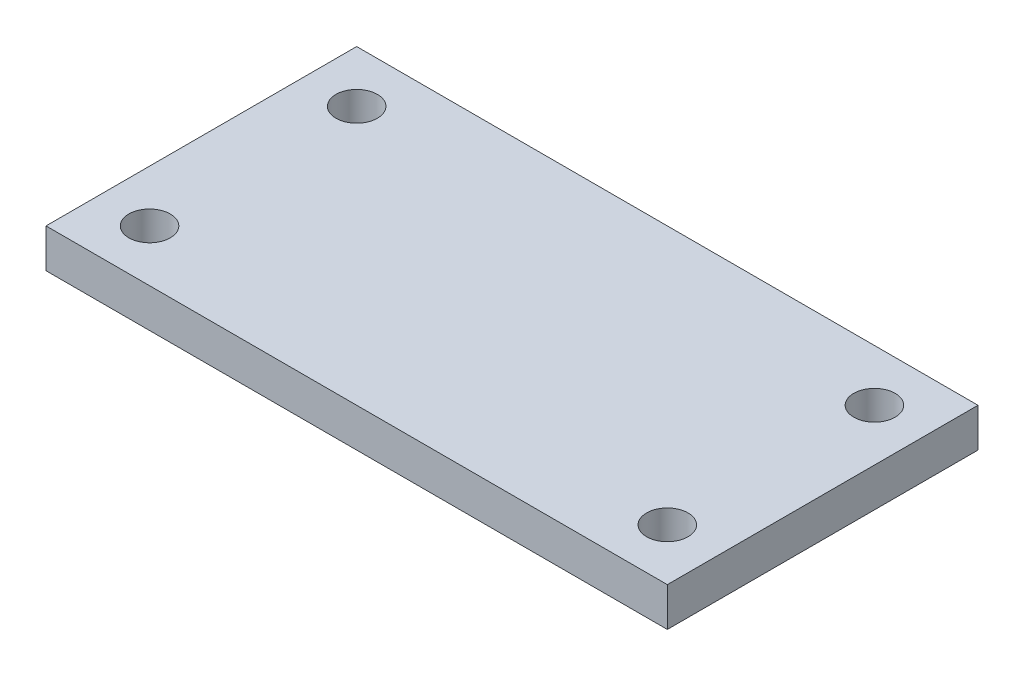
ISO-10303-21;
HEADER;
FILE_DESCRIPTION(('STEP AP214'),'2;1');
FILE_NAME('part.step','',(''),(''),'','','');
FILE_SCHEMA(('AUTOMOTIVE_DESIGN { 1 0 10303 214 1 1 1 1 }'));
ENDSEC;
DATA;
#1=APPLICATION_CONTEXT('core data for automotive mechanical design processes');
#2=APPLICATION_PROTOCOL_DEFINITION('international standard','automotive_design',2000,#1);
#3=PRODUCT_CONTEXT('',#1,'mechanical');
#4=PRODUCT('Part','Part','',(#3));
#5=PRODUCT_RELATED_PRODUCT_CATEGORY('part','',(#4));
#6=PRODUCT_DEFINITION_FORMATION('','',#4);
#7=PRODUCT_DEFINITION_CONTEXT('part definition',#1,'design');
#8=PRODUCT_DEFINITION('design','',#6,#7);
#9=PRODUCT_DEFINITION_SHAPE('','',#8);
#10=(LENGTH_UNIT() NAMED_UNIT(*) SI_UNIT(.MILLI.,.METRE.));
#11=(NAMED_UNIT(*) PLANE_ANGLE_UNIT() SI_UNIT($,.RADIAN.));
#12=(NAMED_UNIT(*) SI_UNIT($,.STERADIAN.) SOLID_ANGLE_UNIT());
#13=UNCERTAINTY_MEASURE_WITH_UNIT(LENGTH_MEASURE(1.E-05),#10,'distance_accuracy_value','');
#14=(GEOMETRIC_REPRESENTATION_CONTEXT(3) GLOBAL_UNCERTAINTY_ASSIGNED_CONTEXT((#13)) GLOBAL_UNIT_ASSIGNED_CONTEXT((#10,
#11,#12)) REPRESENTATION_CONTEXT('',''));
#15=CARTESIAN_POINT('',(0.,0.,0.));
#16=DIRECTION('',(0.,0.,1.));
#17=DIRECTION('',(1.,0.,0.));
#18=AXIS2_PLACEMENT_3D('',#15,#16,#17);
#19=CARTESIAN_POINT('',(38.1,4.7625,19.05));
#20=DIRECTION('',(-1.,0.,0.));
#21=DIRECTION('',(0.,0.,1.));
#22=AXIS2_PLACEMENT_3D('',#19,#20,#21);
#23=PLANE('',#22);
#24=DIRECTION('',(0.,0.,-1.));
#25=VECTOR('',#24,1.);
#26=CARTESIAN_POINT('',(38.1,0.,19.05));
#27=LINE('',#26,#25);
#28=CARTESIAN_POINT('',(38.1,0.,19.05));
#29=VERTEX_POINT('',#28);
#30=CARTESIAN_POINT('',(38.1,0.,-19.05));
#31=VERTEX_POINT('',#30);
#32=EDGE_CURVE('E96',#29,#31,#27,.T.);
#33=ORIENTED_EDGE('',*,*,#32,.T.);
#34=DIRECTION('',(0.,-1.,0.));
#35=VECTOR('',#34,1.);
#36=CARTESIAN_POINT('',(38.1,4.7625,-19.05));
#37=LINE('',#36,#35);
#38=CARTESIAN_POINT('',(38.1,4.7625,-19.05));
#39=VERTEX_POINT('',#38);
#40=EDGE_CURVE('E11',#39,#31,#37,.T.);
#41=ORIENTED_EDGE('',*,*,#40,.F.);
#42=DIRECTION('',(0.,0.,-1.));
#43=VECTOR('',#42,1.);
#44=CARTESIAN_POINT('',(38.1,4.7625,19.05));
#45=LINE('',#44,#43);
#46=CARTESIAN_POINT('',(38.1,4.7625,19.05));
#47=VERTEX_POINT('',#46);
#48=EDGE_CURVE('E84',#47,#39,#45,.T.);
#49=ORIENTED_EDGE('',*,*,#48,.F.);
#50=DIRECTION('',(0.,-1.,0.));
#51=VECTOR('',#50,1.);
#52=CARTESIAN_POINT('',(38.1,4.7625,19.05));
#53=LINE('',#52,#51);
#54=EDGE_CURVE('E92',#47,#29,#53,.T.);
#55=ORIENTED_EDGE('',*,*,#54,.T.);
#56=EDGE_LOOP('',(#33,#41,#49,#55));
#57=FACE_BOUND('',#56,.T.);
#58=ADVANCED_FACE('F33',(#57),#23,.F.);
#59=CARTESIAN_POINT('',(-38.1,4.7625,-19.05));
#60=DIRECTION('',(0.,0.,1.));
#61=DIRECTION('',(1.,0.,0.));
#62=AXIS2_PLACEMENT_3D('',#59,#60,#61);
#63=PLANE('',#62);
#64=DIRECTION('',(-1.,0.,0.));
#65=VECTOR('',#64,1.);
#66=CARTESIAN_POINT('',(-38.1,0.,-19.05));
#67=LINE('',#66,#65);
#68=CARTESIAN_POINT('',(-38.1,0.,-19.05));
#69=VERTEX_POINT('',#68);
#70=EDGE_CURVE('E88',#31,#69,#67,.T.);
#71=ORIENTED_EDGE('',*,*,#70,.T.);
#72=DIRECTION('',(0.,-1.,0.));
#73=VECTOR('',#72,1.);
#74=CARTESIAN_POINT('',(-38.1,4.7625,-19.05));
#75=LINE('',#74,#73);
#76=CARTESIAN_POINT('',(-38.1,4.7625,-19.05));
#77=VERTEX_POINT('',#76);
#78=EDGE_CURVE('E41',#77,#69,#75,.T.);
#79=ORIENTED_EDGE('',*,*,#78,.F.);
#80=DIRECTION('',(-1.,0.,0.));
#81=VECTOR('',#80,1.);
#82=CARTESIAN_POINT('',(-38.1,4.7625,-19.05));
#83=LINE('',#82,#81);
#84=EDGE_CURVE('E79',#39,#77,#83,.T.);
#85=ORIENTED_EDGE('',*,*,#84,.F.);
#86=ORIENTED_EDGE('',*,*,#40,.T.);
#87=EDGE_LOOP('',(#71,#79,#85,#86));
#88=FACE_BOUND('',#87,.T.);
#89=ADVANCED_FACE('F87',(#88),#63,.F.);
#90=CARTESIAN_POINT('',(-38.1,4.7625,19.05));
#91=DIRECTION('',(1.,0.,0.));
#92=DIRECTION('',(0.,0.,-1.));
#93=AXIS2_PLACEMENT_3D('',#90,#91,#92);
#94=PLANE('',#93);
#95=DIRECTION('',(0.,0.,1.));
#96=VECTOR('',#95,1.);
#97=CARTESIAN_POINT('',(-38.1,0.,19.05));
#98=LINE('',#97,#96);
#99=CARTESIAN_POINT('',(-38.1,0.,19.05));
#100=VERTEX_POINT('',#99);
#101=EDGE_CURVE('E66',#69,#100,#98,.T.);
#102=ORIENTED_EDGE('',*,*,#101,.T.);
#103=DIRECTION('',(0.,-1.,0.));
#104=VECTOR('',#103,1.);
#105=CARTESIAN_POINT('',(-38.1,4.7625,19.05));
#106=LINE('',#105,#104);
#107=CARTESIAN_POINT('',(-38.1,4.7625,19.05));
#108=VERTEX_POINT('',#107);
#109=EDGE_CURVE('E89',#108,#100,#106,.T.);
#110=ORIENTED_EDGE('',*,*,#109,.F.);
#111=DIRECTION('',(0.,0.,1.));
#112=VECTOR('',#111,1.);
#113=CARTESIAN_POINT('',(-38.1,4.7625,19.05));
#114=LINE('',#113,#112);
#115=EDGE_CURVE('E82',#77,#108,#114,.T.);
#116=ORIENTED_EDGE('',*,*,#115,.F.);
#117=ORIENTED_EDGE('',*,*,#78,.T.);
#118=EDGE_LOOP('',(#102,#110,#116,#117));
#119=FACE_BOUND('',#118,.T.);
#120=ADVANCED_FACE('F90',(#119),#94,.F.);
#121=CARTESIAN_POINT('',(-38.1,4.7625,19.05));
#122=DIRECTION('',(0.,0.,-1.));
#123=DIRECTION('',(-1.,0.,0.));
#124=AXIS2_PLACEMENT_3D('',#121,#122,#123);
#125=PLANE('',#124);
#126=DIRECTION('',(1.,0.,0.));
#127=VECTOR('',#126,1.);
#128=CARTESIAN_POINT('',(-38.1,0.,19.05));
#129=LINE('',#128,#127);
#130=EDGE_CURVE('E72',#100,#29,#129,.T.);
#131=ORIENTED_EDGE('',*,*,#130,.T.);
#132=ORIENTED_EDGE('',*,*,#54,.F.);
#133=DIRECTION('',(1.,0.,0.));
#134=VECTOR('',#133,1.);
#135=CARTESIAN_POINT('',(-38.1,4.7625,19.05));
#136=LINE('',#135,#134);
#137=EDGE_CURVE('E49',#108,#47,#136,.T.);
#138=ORIENTED_EDGE('',*,*,#137,.F.);
#139=ORIENTED_EDGE('',*,*,#109,.T.);
#140=EDGE_LOOP('',(#131,#132,#138,#139));
#141=FACE_BOUND('',#140,.T.);
#142=ADVANCED_FACE('F104',(#141),#125,.F.);
#143=CARTESIAN_POINT('',(0.,4.7625,0.));
#144=DIRECTION('',(0.,-1.,0.));
#145=DIRECTION('',(0.,0.,-1.));
#146=AXIS2_PLACEMENT_3D('',#143,#144,#145);
#147=PLANE('',#146);
#148=CARTESIAN_POINT('',(-31.7500000000001,4.7625,-12.7));
#149=DIRECTION('',(0.,1.,0.));
#150=DIRECTION('',(0.,0.,1.));
#151=AXIS2_PLACEMENT_3D('',#148,#149,#150);
#152=CIRCLE('',#151,2.54);
#153=CARTESIAN_POINT('',(-31.7500000000001,4.7625,-10.16));
#154=VERTEX_POINT('',#153);
#155=EDGE_CURVE('E128',#154,#154,#152,.T.);
#156=ORIENTED_EDGE('',*,*,#155,.F.);
#157=EDGE_LOOP('',(#156));
#158=FACE_BOUND('',#157,.T.);
#159=CARTESIAN_POINT('',(-31.75,4.7625,12.7));
#160=DIRECTION('',(0.,1.,0.));
#161=DIRECTION('',(0.,0.,1.));
#162=AXIS2_PLACEMENT_3D('',#159,#160,#161);
#163=CIRCLE('',#162,2.54);
#164=CARTESIAN_POINT('',(-31.75,4.7625,15.24));
#165=VERTEX_POINT('',#164);
#166=EDGE_CURVE('E122',#165,#165,#163,.T.);
#167=ORIENTED_EDGE('',*,*,#166,.F.);
#168=EDGE_LOOP('',(#167));
#169=FACE_BOUND('',#168,.T.);
#170=CARTESIAN_POINT('',(31.75,4.7625,12.7));
#171=DIRECTION('',(0.,1.,0.));
#172=DIRECTION('',(0.,0.,1.));
#173=AXIS2_PLACEMENT_3D('',#170,#171,#172);
#174=CIRCLE('',#173,2.54);
#175=CARTESIAN_POINT('',(31.75,4.7625,15.24));
#176=VERTEX_POINT('',#175);
#177=EDGE_CURVE('E116',#176,#176,#174,.T.);
#178=ORIENTED_EDGE('',*,*,#177,.F.);
#179=EDGE_LOOP('',(#178));
#180=FACE_BOUND('',#179,.T.);
#181=CARTESIAN_POINT('',(31.7499999999999,4.7625,-12.7));
#182=DIRECTION('',(0.,1.,0.));
#183=DIRECTION('',(0.,0.,1.));
#184=AXIS2_PLACEMENT_3D('',#181,#182,#183);
#185=CIRCLE('',#184,2.54);
#186=CARTESIAN_POINT('',(31.7499999999999,4.7625,-10.16));
#187=VERTEX_POINT('',#186);
#188=EDGE_CURVE('E110',#187,#187,#185,.T.);
#189=ORIENTED_EDGE('',*,*,#188,.F.);
#190=EDGE_LOOP('',(#189));
#191=FACE_BOUND('',#190,.T.);
#192=ORIENTED_EDGE('',*,*,#48,.T.);
#193=ORIENTED_EDGE('',*,*,#84,.T.);
#194=ORIENTED_EDGE('',*,*,#115,.T.);
#195=ORIENTED_EDGE('',*,*,#137,.T.);
#196=EDGE_LOOP('',(#192,#193,#194,#195));
#197=FACE_BOUND('',#196,.T.);
#198=ADVANCED_FACE('F80',(#158,#169,#180,#191,#197),#147,.F.);
#199=CARTESIAN_POINT('',(0.,0.,0.));
#200=DIRECTION('',(0.,-1.,0.));
#201=DIRECTION('',(0.,0.,-1.));
#202=AXIS2_PLACEMENT_3D('',#199,#200,#201);
#203=PLANE('',#202);
#204=CARTESIAN_POINT('',(-31.7500000000001,0.,-12.7));
#205=DIRECTION('',(0.,1.,0.));
#206=DIRECTION('',(0.,0.,1.));
#207=AXIS2_PLACEMENT_3D('',#204,#205,#206);
#208=CIRCLE('',#207,2.54);
#209=CARTESIAN_POINT('',(-31.7500000000001,0.,-10.16));
#210=VERTEX_POINT('',#209);
#211=EDGE_CURVE('E125',#210,#210,#208,.T.);
#212=ORIENTED_EDGE('',*,*,#211,.T.);
#213=EDGE_LOOP('',(#212));
#214=FACE_BOUND('',#213,.T.);
#215=CARTESIAN_POINT('',(-31.75,0.,12.7));
#216=DIRECTION('',(0.,1.,0.));
#217=DIRECTION('',(0.,0.,1.));
#218=AXIS2_PLACEMENT_3D('',#215,#216,#217);
#219=CIRCLE('',#218,2.54);
#220=CARTESIAN_POINT('',(-31.75,0.,15.24));
#221=VERTEX_POINT('',#220);
#222=EDGE_CURVE('E119',#221,#221,#219,.T.);
#223=ORIENTED_EDGE('',*,*,#222,.T.);
#224=EDGE_LOOP('',(#223));
#225=FACE_BOUND('',#224,.T.);
#226=CARTESIAN_POINT('',(31.75,0.,12.7));
#227=DIRECTION('',(0.,1.,0.));
#228=DIRECTION('',(0.,0.,1.));
#229=AXIS2_PLACEMENT_3D('',#226,#227,#228);
#230=CIRCLE('',#229,2.54);
#231=CARTESIAN_POINT('',(31.75,0.,15.24));
#232=VERTEX_POINT('',#231);
#233=EDGE_CURVE('E113',#232,#232,#230,.T.);
#234=ORIENTED_EDGE('',*,*,#233,.T.);
#235=EDGE_LOOP('',(#234));
#236=FACE_BOUND('',#235,.T.);
#237=CARTESIAN_POINT('',(31.7499999999999,0.,-12.7));
#238=DIRECTION('',(0.,1.,0.));
#239=DIRECTION('',(0.,0.,1.));
#240=AXIS2_PLACEMENT_3D('',#237,#238,#239);
#241=CIRCLE('',#240,2.54);
#242=CARTESIAN_POINT('',(31.7499999999999,0.,-10.16));
#243=VERTEX_POINT('',#242);
#244=EDGE_CURVE('E99',#243,#243,#241,.T.);
#245=ORIENTED_EDGE('',*,*,#244,.T.);
#246=EDGE_LOOP('',(#245));
#247=FACE_BOUND('',#246,.T.);
#248=ORIENTED_EDGE('',*,*,#32,.F.);
#249=ORIENTED_EDGE('',*,*,#130,.F.);
#250=ORIENTED_EDGE('',*,*,#101,.F.);
#251=ORIENTED_EDGE('',*,*,#70,.F.);
#252=EDGE_LOOP('',(#248,#249,#250,#251));
#253=FACE_BOUND('',#252,.T.);
#254=ADVANCED_FACE('F107',(#214,#225,#236,#247,#253),#203,.T.);
#255=CARTESIAN_POINT('',(31.7499999999999,0.,-12.7));
#256=DIRECTION('',(0.,1.,0.));
#257=DIRECTION('',(0.,0.,1.));
#258=AXIS2_PLACEMENT_3D('',#255,#256,#257);
#259=CYLINDRICAL_SURFACE('',#258,2.54);
#260=CARTESIAN_POINT('',(31.7499999999999,0.,-10.16));
#261=CARTESIAN_POINT('',(31.7499999999999,0.049609375,-10.16));
#262=CARTESIAN_POINT('',(31.7499999999999,0.09921875,-10.16));
#263=CARTESIAN_POINT('',(31.7499999999999,0.1984375,-10.16));
#264=CARTESIAN_POINT('',(31.7499999999999,0.248046875,-10.16));
#265=CARTESIAN_POINT('',(31.7499999999999,0.347265625,-10.16));
#266=CARTESIAN_POINT('',(31.7499999999999,0.396875,-10.16));
#267=CARTESIAN_POINT('',(31.7499999999999,0.49609375,-10.16));
#268=CARTESIAN_POINT('',(31.7499999999999,0.545703125,-10.16));
#269=CARTESIAN_POINT('',(31.7499999999999,0.644921875,-10.16));
#270=CARTESIAN_POINT('',(31.7499999999999,0.69453125,-10.16));
#271=CARTESIAN_POINT('',(31.7499999999999,0.79375,-10.16));
#272=CARTESIAN_POINT('',(31.7499999999999,0.843359375,-10.16));
#273=CARTESIAN_POINT('',(31.7499999999999,0.942578125,-10.16));
#274=CARTESIAN_POINT('',(31.7499999999999,0.9921875,-10.16));
#275=CARTESIAN_POINT('',(31.7499999999999,1.09140625,-10.16));
#276=CARTESIAN_POINT('',(31.7499999999999,1.141015625,-10.16));
#277=CARTESIAN_POINT('',(31.7499999999999,1.240234375,-10.16));
#278=CARTESIAN_POINT('',(31.7499999999999,1.28984375,-10.16));
#279=CARTESIAN_POINT('',(31.7499999999999,1.3890625,-10.16));
#280=CARTESIAN_POINT('',(31.7499999999999,1.438671875,-10.16));
#281=CARTESIAN_POINT('',(31.7499999999999,1.537890625,-10.16));
#282=CARTESIAN_POINT('',(31.7499999999999,1.5875,-10.16));
#283=CARTESIAN_POINT('',(31.7499999999999,1.68671875,-10.16));
#284=CARTESIAN_POINT('',(31.7499999999999,1.736328125,-10.16));
#285=CARTESIAN_POINT('',(31.7499999999999,1.835546875,-10.16));
#286=CARTESIAN_POINT('',(31.7499999999999,1.88515625,-10.16));
#287=CARTESIAN_POINT('',(31.7499999999999,1.984375,-10.16));
#288=CARTESIAN_POINT('',(31.7499999999999,2.033984375,-10.16));
#289=CARTESIAN_POINT('',(31.7499999999999,2.133203125,-10.16));
#290=CARTESIAN_POINT('',(31.7499999999999,2.1828125,-10.16));
#291=CARTESIAN_POINT('',(31.7499999999999,2.28203125,-10.16));
#292=CARTESIAN_POINT('',(31.7499999999999,2.331640625,-10.16));
#293=CARTESIAN_POINT('',(31.7499999999999,2.430859375,-10.16));
#294=CARTESIAN_POINT('',(31.7499999999999,2.48046875,-10.16));
#295=CARTESIAN_POINT('',(31.7499999999999,2.5796875,-10.16));
#296=CARTESIAN_POINT('',(31.7499999999999,2.629296875,-10.16));
#297=CARTESIAN_POINT('',(31.7499999999999,2.728515625,-10.16));
#298=CARTESIAN_POINT('',(31.7499999999999,2.778125,-10.16));
#299=CARTESIAN_POINT('',(31.7499999999999,2.87734375,-10.16));
#300=CARTESIAN_POINT('',(31.7499999999999,2.926953125,-10.16));
#301=CARTESIAN_POINT('',(31.7499999999999,3.026171875,-10.16));
#302=CARTESIAN_POINT('',(31.7499999999999,3.07578125,-10.16));
#303=CARTESIAN_POINT('',(31.7499999999999,3.175,-10.16));
#304=CARTESIAN_POINT('',(31.7499999999999,3.224609375,-10.16));
#305=CARTESIAN_POINT('',(31.7499999999999,3.323828125,-10.16));
#306=CARTESIAN_POINT('',(31.7499999999999,3.3734375,-10.16));
#307=CARTESIAN_POINT('',(31.7499999999999,3.47265625,-10.16));
#308=CARTESIAN_POINT('',(31.7499999999999,3.522265625,-10.16));
#309=CARTESIAN_POINT('',(31.7499999999999,3.621484375,-10.16));
#310=CARTESIAN_POINT('',(31.7499999999999,3.67109375,-10.16));
#311=CARTESIAN_POINT('',(31.7499999999999,3.7703125,-10.16));
#312=CARTESIAN_POINT('',(31.7499999999999,3.819921875,-10.16));
#313=CARTESIAN_POINT('',(31.7499999999999,3.919140625,-10.16));
#314=CARTESIAN_POINT('',(31.7499999999999,3.96875,-10.16));
#315=CARTESIAN_POINT('',(31.7499999999999,4.06796875,-10.16));
#316=CARTESIAN_POINT('',(31.7499999999999,4.117578125,-10.16));
#317=CARTESIAN_POINT('',(31.7499999999999,4.216796875,-10.16));
#318=CARTESIAN_POINT('',(31.7499999999999,4.26640625,-10.16));
#319=CARTESIAN_POINT('',(31.7499999999999,4.365625,-10.16));
#320=CARTESIAN_POINT('',(31.7499999999999,4.415234375,-10.16));
#321=CARTESIAN_POINT('',(31.7499999999999,4.514453125,-10.16));
#322=CARTESIAN_POINT('',(31.7499999999999,4.5640625,-10.16));
#323=CARTESIAN_POINT('',(31.7499999999999,4.66328125,-10.16));
#324=CARTESIAN_POINT('',(31.7499999999999,4.712890625,-10.16));
#325=CARTESIAN_POINT('',(31.7499999999999,4.7625,-10.16));
#326=B_SPLINE_CURVE_WITH_KNOTS('',3,(#260,#261,#262,#263,#264,#265,#266,#267,#268,#269,#270,
#271,#272,#273,#274,#275,#276,#277,#278,#279,#280,#281,#282,#283,#284,#285,#286,#287,#288,#289,
#290,#291,#292,#293,#294,#295,#296,#297,#298,#299,#300,#301,#302,#303,#304,#305,#306,#307,#308,
#309,#310,#311,#312,#313,#314,#315,#316,#317,#318,#319,#320,#321,#322,#323,#324,#325),
.UNSPECIFIED.,.F.,.F.,(4,2,2,2,2,2,2,2,2,2,2,2,2,2,2,2,2,2,2,2,2,2,2,2,2,2,2,2,2,2,2,2,4),(0.,
0.148828125,0.29765625,0.446484375,0.5953125,0.744140625,0.89296875,1.041796875,1.190625,
1.339453125,1.48828125,1.637109375,1.7859375,1.934765625,2.08359375,2.232421875,2.38125,
2.530078125,2.67890625,2.827734375,2.9765625,3.125390625,3.27421875,3.423046875,3.571875,
3.720703125,3.86953125,4.018359375,4.1671875,4.316015625,4.46484375,4.613671875,4.7625),.UNSPECIFIED.);
#327=EDGE_CURVE('BSEAM152',#243,#187,#326,.T.);
#328=ORIENTED_EDGE('',*,*,#244,.F.);
#329=ORIENTED_EDGE('',*,*,#188,.T.);
#330=ORIENTED_EDGE('',*,*,#327,.T.);
#331=ORIENTED_EDGE('',*,*,#327,.F.);
#332=EDGE_LOOP('',(#328,#330,#329,#331));
#333=FACE_BOUND('',#332,.T.);
#334=ADVANCED_FACE('F152',(#333),#259,.F.);
#335=CARTESIAN_POINT('',(31.75,0.,12.7));
#336=DIRECTION('',(0.,1.,0.));
#337=DIRECTION('',(0.,0.,1.));
#338=AXIS2_PLACEMENT_3D('',#335,#336,#337);
#339=CYLINDRICAL_SURFACE('',#338,2.54);
#340=CARTESIAN_POINT('',(31.75,0.,15.24));
#341=CARTESIAN_POINT('',(31.75,0.049609375,15.24));
#342=CARTESIAN_POINT('',(31.75,0.09921875,15.24));
#343=CARTESIAN_POINT('',(31.75,0.1984375,15.24));
#344=CARTESIAN_POINT('',(31.75,0.248046875,15.24));
#345=CARTESIAN_POINT('',(31.75,0.347265625,15.24));
#346=CARTESIAN_POINT('',(31.75,0.396875,15.24));
#347=CARTESIAN_POINT('',(31.75,0.49609375,15.24));
#348=CARTESIAN_POINT('',(31.75,0.545703125,15.24));
#349=CARTESIAN_POINT('',(31.75,0.644921875,15.24));
#350=CARTESIAN_POINT('',(31.75,0.69453125,15.24));
#351=CARTESIAN_POINT('',(31.75,0.79375,15.24));
#352=CARTESIAN_POINT('',(31.75,0.843359375,15.24));
#353=CARTESIAN_POINT('',(31.75,0.942578125,15.24));
#354=CARTESIAN_POINT('',(31.75,0.9921875,15.24));
#355=CARTESIAN_POINT('',(31.75,1.09140625,15.24));
#356=CARTESIAN_POINT('',(31.75,1.141015625,15.24));
#357=CARTESIAN_POINT('',(31.75,1.240234375,15.24));
#358=CARTESIAN_POINT('',(31.75,1.28984375,15.24));
#359=CARTESIAN_POINT('',(31.75,1.3890625,15.24));
#360=CARTESIAN_POINT('',(31.75,1.438671875,15.24));
#361=CARTESIAN_POINT('',(31.75,1.537890625,15.24));
#362=CARTESIAN_POINT('',(31.75,1.5875,15.24));
#363=CARTESIAN_POINT('',(31.75,1.68671875,15.24));
#364=CARTESIAN_POINT('',(31.75,1.736328125,15.24));
#365=CARTESIAN_POINT('',(31.75,1.835546875,15.24));
#366=CARTESIAN_POINT('',(31.75,1.88515625,15.24));
#367=CARTESIAN_POINT('',(31.75,1.984375,15.24));
#368=CARTESIAN_POINT('',(31.75,2.033984375,15.24));
#369=CARTESIAN_POINT('',(31.75,2.133203125,15.24));
#370=CARTESIAN_POINT('',(31.75,2.1828125,15.24));
#371=CARTESIAN_POINT('',(31.75,2.28203125,15.24));
#372=CARTESIAN_POINT('',(31.75,2.331640625,15.24));
#373=CARTESIAN_POINT('',(31.75,2.430859375,15.24));
#374=CARTESIAN_POINT('',(31.75,2.48046875,15.24));
#375=CARTESIAN_POINT('',(31.75,2.5796875,15.24));
#376=CARTESIAN_POINT('',(31.75,2.629296875,15.24));
#377=CARTESIAN_POINT('',(31.75,2.728515625,15.24));
#378=CARTESIAN_POINT('',(31.75,2.778125,15.24));
#379=CARTESIAN_POINT('',(31.75,2.87734375,15.24));
#380=CARTESIAN_POINT('',(31.75,2.926953125,15.24));
#381=CARTESIAN_POINT('',(31.75,3.026171875,15.24));
#382=CARTESIAN_POINT('',(31.75,3.07578125,15.24));
#383=CARTESIAN_POINT('',(31.75,3.175,15.24));
#384=CARTESIAN_POINT('',(31.75,3.224609375,15.24));
#385=CARTESIAN_POINT('',(31.75,3.323828125,15.24));
#386=CARTESIAN_POINT('',(31.75,3.3734375,15.24));
#387=CARTESIAN_POINT('',(31.75,3.47265625,15.24));
#388=CARTESIAN_POINT('',(31.75,3.522265625,15.24));
#389=CARTESIAN_POINT('',(31.75,3.621484375,15.24));
#390=CARTESIAN_POINT('',(31.75,3.67109375,15.24));
#391=CARTESIAN_POINT('',(31.75,3.7703125,15.24));
#392=CARTESIAN_POINT('',(31.75,3.819921875,15.24));
#393=CARTESIAN_POINT('',(31.75,3.919140625,15.24));
#394=CARTESIAN_POINT('',(31.75,3.96875,15.24));
#395=CARTESIAN_POINT('',(31.75,4.06796875,15.24));
#396=CARTESIAN_POINT('',(31.75,4.117578125,15.24));
#397=CARTESIAN_POINT('',(31.75,4.216796875,15.24));
#398=CARTESIAN_POINT('',(31.75,4.26640625,15.24));
#399=CARTESIAN_POINT('',(31.75,4.365625,15.24));
#400=CARTESIAN_POINT('',(31.75,4.415234375,15.24));
#401=CARTESIAN_POINT('',(31.75,4.514453125,15.24));
#402=CARTESIAN_POINT('',(31.75,4.5640625,15.24));
#403=CARTESIAN_POINT('',(31.75,4.66328125,15.24));
#404=CARTESIAN_POINT('',(31.75,4.712890625,15.24));
#405=CARTESIAN_POINT('',(31.75,4.7625,15.24));
#406=B_SPLINE_CURVE_WITH_KNOTS('',3,(#340,#341,#342,#343,#344,#345,#346,#347,#348,#349,#350,
#351,#352,#353,#354,#355,#356,#357,#358,#359,#360,#361,#362,#363,#364,#365,#366,#367,#368,#369,
#370,#371,#372,#373,#374,#375,#376,#377,#378,#379,#380,#381,#382,#383,#384,#385,#386,#387,#388,
#389,#390,#391,#392,#393,#394,#395,#396,#397,#398,#399,#400,#401,#402,#403,#404,#405),
.UNSPECIFIED.,.F.,.F.,(4,2,2,2,2,2,2,2,2,2,2,2,2,2,2,2,2,2,2,2,2,2,2,2,2,2,2,2,2,2,2,2,4),(0.,
0.148828125,0.29765625,0.446484375,0.5953125,0.744140625,0.89296875,1.041796875,1.190625,
1.339453125,1.48828125,1.637109375,1.7859375,1.934765625,2.08359375,2.232421875,2.38125,
2.530078125,2.67890625,2.827734375,2.9765625,3.125390625,3.27421875,3.423046875,3.571875,
3.720703125,3.86953125,4.018359375,4.1671875,4.316015625,4.46484375,4.613671875,4.7625),.UNSPECIFIED.);
#407=EDGE_CURVE('BSEAM154',#232,#176,#406,.T.);
#408=ORIENTED_EDGE('',*,*,#233,.F.);
#409=ORIENTED_EDGE('',*,*,#177,.T.);
#410=ORIENTED_EDGE('',*,*,#407,.T.);
#411=ORIENTED_EDGE('',*,*,#407,.F.);
#412=EDGE_LOOP('',(#408,#410,#409,#411));
#413=FACE_BOUND('',#412,.T.);
#414=ADVANCED_FACE('F154',(#413),#339,.F.);
#415=CARTESIAN_POINT('',(-31.75,0.,12.7));
#416=DIRECTION('',(0.,1.,0.));
#417=DIRECTION('',(0.,0.,1.));
#418=AXIS2_PLACEMENT_3D('',#415,#416,#417);
#419=CYLINDRICAL_SURFACE('',#418,2.54);
#420=CARTESIAN_POINT('',(-31.75,0.,15.24));
#421=CARTESIAN_POINT('',(-31.75,0.049609375,15.24));
#422=CARTESIAN_POINT('',(-31.75,0.09921875,15.24));
#423=CARTESIAN_POINT('',(-31.75,0.1984375,15.24));
#424=CARTESIAN_POINT('',(-31.75,0.248046875,15.24));
#425=CARTESIAN_POINT('',(-31.75,0.347265625,15.24));
#426=CARTESIAN_POINT('',(-31.75,0.396875,15.24));
#427=CARTESIAN_POINT('',(-31.75,0.49609375,15.24));
#428=CARTESIAN_POINT('',(-31.75,0.545703125,15.24));
#429=CARTESIAN_POINT('',(-31.75,0.644921875,15.24));
#430=CARTESIAN_POINT('',(-31.75,0.69453125,15.24));
#431=CARTESIAN_POINT('',(-31.75,0.79375,15.24));
#432=CARTESIAN_POINT('',(-31.75,0.843359375,15.24));
#433=CARTESIAN_POINT('',(-31.75,0.942578125,15.24));
#434=CARTESIAN_POINT('',(-31.75,0.9921875,15.24));
#435=CARTESIAN_POINT('',(-31.75,1.09140625,15.24));
#436=CARTESIAN_POINT('',(-31.75,1.141015625,15.24));
#437=CARTESIAN_POINT('',(-31.75,1.240234375,15.24));
#438=CARTESIAN_POINT('',(-31.75,1.28984375,15.24));
#439=CARTESIAN_POINT('',(-31.75,1.3890625,15.24));
#440=CARTESIAN_POINT('',(-31.75,1.438671875,15.24));
#441=CARTESIAN_POINT('',(-31.75,1.537890625,15.24));
#442=CARTESIAN_POINT('',(-31.75,1.5875,15.24));
#443=CARTESIAN_POINT('',(-31.75,1.68671875,15.24));
#444=CARTESIAN_POINT('',(-31.75,1.736328125,15.24));
#445=CARTESIAN_POINT('',(-31.75,1.835546875,15.24));
#446=CARTESIAN_POINT('',(-31.75,1.88515625,15.24));
#447=CARTESIAN_POINT('',(-31.75,1.984375,15.24));
#448=CARTESIAN_POINT('',(-31.75,2.033984375,15.24));
#449=CARTESIAN_POINT('',(-31.75,2.133203125,15.24));
#450=CARTESIAN_POINT('',(-31.75,2.1828125,15.24));
#451=CARTESIAN_POINT('',(-31.75,2.28203125,15.24));
#452=CARTESIAN_POINT('',(-31.75,2.331640625,15.24));
#453=CARTESIAN_POINT('',(-31.75,2.430859375,15.24));
#454=CARTESIAN_POINT('',(-31.75,2.48046875,15.24));
#455=CARTESIAN_POINT('',(-31.75,2.5796875,15.24));
#456=CARTESIAN_POINT('',(-31.75,2.629296875,15.24));
#457=CARTESIAN_POINT('',(-31.75,2.728515625,15.24));
#458=CARTESIAN_POINT('',(-31.75,2.778125,15.24));
#459=CARTESIAN_POINT('',(-31.75,2.87734375,15.24));
#460=CARTESIAN_POINT('',(-31.75,2.926953125,15.24));
#461=CARTESIAN_POINT('',(-31.75,3.026171875,15.24));
#462=CARTESIAN_POINT('',(-31.75,3.07578125,15.24));
#463=CARTESIAN_POINT('',(-31.75,3.175,15.24));
#464=CARTESIAN_POINT('',(-31.75,3.224609375,15.24));
#465=CARTESIAN_POINT('',(-31.75,3.323828125,15.24));
#466=CARTESIAN_POINT('',(-31.75,3.3734375,15.24));
#467=CARTESIAN_POINT('',(-31.75,3.47265625,15.24));
#468=CARTESIAN_POINT('',(-31.75,3.522265625,15.24));
#469=CARTESIAN_POINT('',(-31.75,3.621484375,15.24));
#470=CARTESIAN_POINT('',(-31.75,3.67109375,15.24));
#471=CARTESIAN_POINT('',(-31.75,3.7703125,15.24));
#472=CARTESIAN_POINT('',(-31.75,3.819921875,15.24));
#473=CARTESIAN_POINT('',(-31.75,3.919140625,15.24));
#474=CARTESIAN_POINT('',(-31.75,3.96875,15.24));
#475=CARTESIAN_POINT('',(-31.75,4.06796875,15.24));
#476=CARTESIAN_POINT('',(-31.75,4.117578125,15.24));
#477=CARTESIAN_POINT('',(-31.75,4.216796875,15.24));
#478=CARTESIAN_POINT('',(-31.75,4.26640625,15.24));
#479=CARTESIAN_POINT('',(-31.75,4.365625,15.24));
#480=CARTESIAN_POINT('',(-31.75,4.415234375,15.24));
#481=CARTESIAN_POINT('',(-31.75,4.514453125,15.24));
#482=CARTESIAN_POINT('',(-31.75,4.5640625,15.24));
#483=CARTESIAN_POINT('',(-31.75,4.66328125,15.24));
#484=CARTESIAN_POINT('',(-31.75,4.712890625,15.24));
#485=CARTESIAN_POINT('',(-31.75,4.7625,15.24));
#486=B_SPLINE_CURVE_WITH_KNOTS('',3,(#420,#421,#422,#423,#424,#425,#426,#427,#428,#429,#430,
#431,#432,#433,#434,#435,#436,#437,#438,#439,#440,#441,#442,#443,#444,#445,#446,#447,#448,#449,
#450,#451,#452,#453,#454,#455,#456,#457,#458,#459,#460,#461,#462,#463,#464,#465,#466,#467,#468,
#469,#470,#471,#472,#473,#474,#475,#476,#477,#478,#479,#480,#481,#482,#483,#484,#485),
.UNSPECIFIED.,.F.,.F.,(4,2,2,2,2,2,2,2,2,2,2,2,2,2,2,2,2,2,2,2,2,2,2,2,2,2,2,2,2,2,2,2,4),(0.,
0.148828125,0.29765625,0.446484375,0.5953125,0.744140625,0.89296875,1.041796875,1.190625,
1.339453125,1.48828125,1.637109375,1.7859375,1.934765625,2.08359375,2.232421875,2.38125,
2.530078125,2.67890625,2.827734375,2.9765625,3.125390625,3.27421875,3.423046875,3.571875,
3.720703125,3.86953125,4.018359375,4.1671875,4.316015625,4.46484375,4.613671875,4.7625),.UNSPECIFIED.);
#487=EDGE_CURVE('BSEAM139',#221,#165,#486,.T.);
#488=ORIENTED_EDGE('',*,*,#222,.F.);
#489=ORIENTED_EDGE('',*,*,#166,.T.);
#490=ORIENTED_EDGE('',*,*,#487,.T.);
#491=ORIENTED_EDGE('',*,*,#487,.F.);
#492=EDGE_LOOP('',(#488,#490,#489,#491));
#493=FACE_BOUND('',#492,.T.);
#494=ADVANCED_FACE('F139',(#493),#419,.F.);
#495=CARTESIAN_POINT('',(-31.7500000000001,0.,-12.7));
#496=DIRECTION('',(0.,1.,0.));
#497=DIRECTION('',(0.,0.,1.));
#498=AXIS2_PLACEMENT_3D('',#495,#496,#497);
#499=CYLINDRICAL_SURFACE('',#498,2.54);
#500=CARTESIAN_POINT('',(-31.7500000000001,0.,-10.16));
#501=CARTESIAN_POINT('',(-31.7500000000001,0.049609375,-10.16));
#502=CARTESIAN_POINT('',(-31.7500000000001,0.09921875,-10.16));
#503=CARTESIAN_POINT('',(-31.7500000000001,0.1984375,-10.16));
#504=CARTESIAN_POINT('',(-31.7500000000001,0.248046875,-10.16));
#505=CARTESIAN_POINT('',(-31.7500000000001,0.347265625,-10.16));
#506=CARTESIAN_POINT('',(-31.7500000000001,0.396875,-10.16));
#507=CARTESIAN_POINT('',(-31.7500000000001,0.49609375,-10.16));
#508=CARTESIAN_POINT('',(-31.7500000000001,0.545703125,-10.16));
#509=CARTESIAN_POINT('',(-31.7500000000001,0.644921875,-10.16));
#510=CARTESIAN_POINT('',(-31.7500000000001,0.69453125,-10.16));
#511=CARTESIAN_POINT('',(-31.7500000000001,0.79375,-10.16));
#512=CARTESIAN_POINT('',(-31.7500000000001,0.843359375,-10.16));
#513=CARTESIAN_POINT('',(-31.7500000000001,0.942578125,-10.16));
#514=CARTESIAN_POINT('',(-31.7500000000001,0.9921875,-10.16));
#515=CARTESIAN_POINT('',(-31.7500000000001,1.09140625,-10.16));
#516=CARTESIAN_POINT('',(-31.7500000000001,1.141015625,-10.16));
#517=CARTESIAN_POINT('',(-31.7500000000001,1.240234375,-10.16));
#518=CARTESIAN_POINT('',(-31.7500000000001,1.28984375,-10.16));
#519=CARTESIAN_POINT('',(-31.7500000000001,1.3890625,-10.16));
#520=CARTESIAN_POINT('',(-31.7500000000001,1.438671875,-10.16));
#521=CARTESIAN_POINT('',(-31.7500000000001,1.537890625,-10.16));
#522=CARTESIAN_POINT('',(-31.7500000000001,1.5875,-10.16));
#523=CARTESIAN_POINT('',(-31.7500000000001,1.68671875,-10.16));
#524=CARTESIAN_POINT('',(-31.7500000000001,1.736328125,-10.16));
#525=CARTESIAN_POINT('',(-31.7500000000001,1.835546875,-10.16));
#526=CARTESIAN_POINT('',(-31.7500000000001,1.88515625,-10.16));
#527=CARTESIAN_POINT('',(-31.7500000000001,1.984375,-10.16));
#528=CARTESIAN_POINT('',(-31.7500000000001,2.033984375,-10.16));
#529=CARTESIAN_POINT('',(-31.7500000000001,2.133203125,-10.16));
#530=CARTESIAN_POINT('',(-31.7500000000001,2.1828125,-10.16));
#531=CARTESIAN_POINT('',(-31.7500000000001,2.28203125,-10.16));
#532=CARTESIAN_POINT('',(-31.7500000000001,2.331640625,-10.16));
#533=CARTESIAN_POINT('',(-31.7500000000001,2.430859375,-10.16));
#534=CARTESIAN_POINT('',(-31.7500000000001,2.48046875,-10.16));
#535=CARTESIAN_POINT('',(-31.7500000000001,2.5796875,-10.16));
#536=CARTESIAN_POINT('',(-31.7500000000001,2.629296875,-10.16));
#537=CARTESIAN_POINT('',(-31.7500000000001,2.728515625,-10.16));
#538=CARTESIAN_POINT('',(-31.7500000000001,2.778125,-10.16));
#539=CARTESIAN_POINT('',(-31.7500000000001,2.87734375,-10.16));
#540=CARTESIAN_POINT('',(-31.7500000000001,2.926953125,-10.16));
#541=CARTESIAN_POINT('',(-31.7500000000001,3.026171875,-10.16));
#542=CARTESIAN_POINT('',(-31.7500000000001,3.07578125,-10.16));
#543=CARTESIAN_POINT('',(-31.7500000000001,3.175,-10.16));
#544=CARTESIAN_POINT('',(-31.7500000000001,3.224609375,-10.16));
#545=CARTESIAN_POINT('',(-31.7500000000001,3.323828125,-10.16));
#546=CARTESIAN_POINT('',(-31.7500000000001,3.3734375,-10.16));
#547=CARTESIAN_POINT('',(-31.7500000000001,3.47265625,-10.16));
#548=CARTESIAN_POINT('',(-31.7500000000001,3.522265625,-10.16));
#549=CARTESIAN_POINT('',(-31.7500000000001,3.621484375,-10.16));
#550=CARTESIAN_POINT('',(-31.7500000000001,3.67109375,-10.16));
#551=CARTESIAN_POINT('',(-31.7500000000001,3.7703125,-10.16));
#552=CARTESIAN_POINT('',(-31.7500000000001,3.819921875,-10.16));
#553=CARTESIAN_POINT('',(-31.7500000000001,3.919140625,-10.16));
#554=CARTESIAN_POINT('',(-31.7500000000001,3.96875,-10.16));
#555=CARTESIAN_POINT('',(-31.7500000000001,4.06796875,-10.16));
#556=CARTESIAN_POINT('',(-31.7500000000001,4.117578125,-10.16));
#557=CARTESIAN_POINT('',(-31.7500000000001,4.216796875,-10.16));
#558=CARTESIAN_POINT('',(-31.7500000000001,4.26640625,-10.16));
#559=CARTESIAN_POINT('',(-31.7500000000001,4.365625,-10.16));
#560=CARTESIAN_POINT('',(-31.7500000000001,4.415234375,-10.16));
#561=CARTESIAN_POINT('',(-31.7500000000001,4.514453125,-10.16));
#562=CARTESIAN_POINT('',(-31.7500000000001,4.5640625,-10.16));
#563=CARTESIAN_POINT('',(-31.7500000000001,4.66328125,-10.16));
#564=CARTESIAN_POINT('',(-31.7500000000001,4.712890625,-10.16));
#565=CARTESIAN_POINT('',(-31.7500000000001,4.7625,-10.16));
#566=B_SPLINE_CURVE_WITH_KNOTS('',3,(#500,#501,#502,#503,#504,#505,#506,#507,#508,#509,#510,
#511,#512,#513,#514,#515,#516,#517,#518,#519,#520,#521,#522,#523,#524,#525,#526,#527,#528,#529,
#530,#531,#532,#533,#534,#535,#536,#537,#538,#539,#540,#541,#542,#543,#544,#545,#546,#547,#548,
#549,#550,#551,#552,#553,#554,#555,#556,#557,#558,#559,#560,#561,#562,#563,#564,#565),
.UNSPECIFIED.,.F.,.F.,(4,2,2,2,2,2,2,2,2,2,2,2,2,2,2,2,2,2,2,2,2,2,2,2,2,2,2,2,2,2,2,2,4),(0.,
0.148828125,0.29765625,0.446484375,0.5953125,0.744140625,0.89296875,1.041796875,1.190625,
1.339453125,1.48828125,1.637109375,1.7859375,1.934765625,2.08359375,2.232421875,2.38125,
2.530078125,2.67890625,2.827734375,2.9765625,3.125390625,3.27421875,3.423046875,3.571875,
3.720703125,3.86953125,4.018359375,4.1671875,4.316015625,4.46484375,4.613671875,4.7625),.UNSPECIFIED.);
#567=EDGE_CURVE('BSEAM136',#210,#154,#566,.T.);
#568=ORIENTED_EDGE('',*,*,#211,.F.);
#569=ORIENTED_EDGE('',*,*,#155,.T.);
#570=ORIENTED_EDGE('',*,*,#567,.T.);
#571=ORIENTED_EDGE('',*,*,#567,.F.);
#572=EDGE_LOOP('',(#568,#570,#569,#571));
#573=FACE_BOUND('',#572,.T.);
#574=ADVANCED_FACE('F136',(#573),#499,.F.);
#575=CLOSED_SHELL('',(#58,#89,#120,#142,#198,#254,#334,#414,#494,#574));
#576=MANIFOLD_SOLID_BREP('B2',#575);
#577=ADVANCED_BREP_SHAPE_REPRESENTATION('',(#18,#576),#14);
#578=SHAPE_DEFINITION_REPRESENTATION(#9,#577);
ENDSEC;
END-ISO-10303-21;
